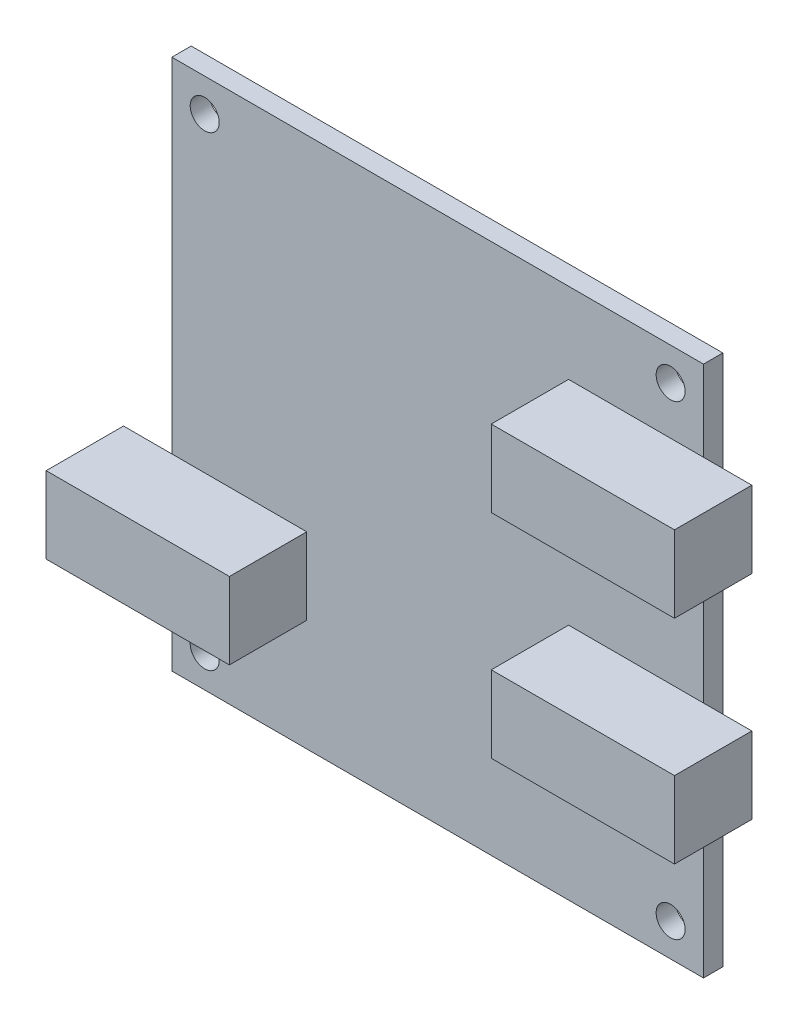
ISO-10303-21;
HEADER;
FILE_DESCRIPTION(('STEP AP214'),'2;1');
FILE_NAME('part.step','',(''),(''),'','','');
FILE_SCHEMA(('AUTOMOTIVE_DESIGN { 1 0 10303 214 1 1 1 1 }'));
ENDSEC;
DATA;
#1=APPLICATION_CONTEXT('core data for automotive mechanical design processes');
#2=APPLICATION_PROTOCOL_DEFINITION('international standard','automotive_design',2000,#1);
#3=PRODUCT_CONTEXT('',#1,'mechanical');
#4=PRODUCT('Part','Part','',(#3));
#5=PRODUCT_RELATED_PRODUCT_CATEGORY('part','',(#4));
#6=PRODUCT_DEFINITION_FORMATION('','',#4);
#7=PRODUCT_DEFINITION_CONTEXT('part definition',#1,'design');
#8=PRODUCT_DEFINITION('design','',#6,#7);
#9=PRODUCT_DEFINITION_SHAPE('','',#8);
#10=(LENGTH_UNIT() NAMED_UNIT(*) SI_UNIT(.MILLI.,.METRE.));
#11=(NAMED_UNIT(*) PLANE_ANGLE_UNIT() SI_UNIT($,.RADIAN.));
#12=(NAMED_UNIT(*) SI_UNIT($,.STERADIAN.) SOLID_ANGLE_UNIT());
#13=UNCERTAINTY_MEASURE_WITH_UNIT(LENGTH_MEASURE(1.E-05),#10,'distance_accuracy_value','');
#14=(GEOMETRIC_REPRESENTATION_CONTEXT(3) GLOBAL_UNCERTAINTY_ASSIGNED_CONTEXT((#13)) GLOBAL_UNIT_ASSIGNED_CONTEXT((#10,
#11,#12)) REPRESENTATION_CONTEXT('',''));
#15=CARTESIAN_POINT('',(0.,0.,0.));
#16=DIRECTION('',(0.,0.,1.));
#17=DIRECTION('',(1.,0.,0.));
#18=AXIS2_PLACEMENT_3D('',#15,#16,#17);
#19=CARTESIAN_POINT('',(13.5436408472055,-2.86503978913871,10.));
#20=DIRECTION('',(1.,0.,0.));
#21=DIRECTION('',(0.,1.,0.));
#22=AXIS2_PLACEMENT_3D('',#19,#20,#21);
#23=PLANE('',#22);
#24=DIRECTION('',(0.,-1.,0.));
#25=VECTOR('',#24,1.);
#26=CARTESIAN_POINT('',(13.5436408472055,-2.86503978913871,2.));
#27=LINE('',#26,#25);
#28=CARTESIAN_POINT('',(13.5436408472055,-2.86503978913871,2.));
#29=VERTEX_POINT('',#28);
#30=CARTESIAN_POINT('',(13.5436408472055,-10.7929581097691,2.));
#31=VERTEX_POINT('',#30);
#32=EDGE_CURVE('E12',#29,#31,#27,.T.);
#33=ORIENTED_EDGE('',*,*,#32,.T.);
#34=DIRECTION('',(0.,0.,-1.));
#35=VECTOR('',#34,1.);
#36=CARTESIAN_POINT('',(13.5436408472055,-10.7929581097691,10.));
#37=LINE('',#36,#35);
#38=CARTESIAN_POINT('',(13.5436408472055,-10.7929581097691,10.));
#39=VERTEX_POINT('',#38);
#40=EDGE_CURVE('E121',#39,#31,#37,.T.);
#41=ORIENTED_EDGE('',*,*,#40,.F.);
#42=DIRECTION('',(0.,-1.,0.));
#43=VECTOR('',#42,1.);
#44=CARTESIAN_POINT('',(13.5436408472055,-2.86503978913871,10.));
#45=LINE('',#44,#43);
#46=CARTESIAN_POINT('',(13.5436408472055,-2.86503978913871,10.));
#47=VERTEX_POINT('',#46);
#48=EDGE_CURVE('E54',#47,#39,#45,.T.);
#49=ORIENTED_EDGE('',*,*,#48,.F.);
#50=DIRECTION('',(0.,0.,-1.));
#51=VECTOR('',#50,1.);
#52=CARTESIAN_POINT('',(13.5436408472055,-2.86503978913871,10.));
#53=LINE('',#52,#51);
#54=EDGE_CURVE('E109',#47,#29,#53,.T.);
#55=ORIENTED_EDGE('',*,*,#54,.T.);
#56=EDGE_LOOP('',(#33,#41,#49,#55));
#57=FACE_BOUND('',#56,.T.);
#58=ADVANCED_FACE('F50',(#57),#23,.F.);
#59=CARTESIAN_POINT('',(13.5436408472055,-10.7929581097691,10.));
#60=DIRECTION('',(0.,1.,0.));
#61=DIRECTION('',(-1.,0.,0.));
#62=AXIS2_PLACEMENT_3D('',#59,#60,#61);
#63=PLANE('',#62);
#64=DIRECTION('',(1.,0.,0.));
#65=VECTOR('',#64,1.);
#66=CARTESIAN_POINT('',(13.5436408472055,-10.7929581097691,2.));
#67=LINE('',#66,#65);
#68=CARTESIAN_POINT('',(32.5,-10.7929581097691,2.));
#69=VERTEX_POINT('',#68);
#70=EDGE_CURVE('E60',#31,#69,#67,.T.);
#71=ORIENTED_EDGE('',*,*,#70,.T.);
#72=DIRECTION('',(0.,0.,-1.));
#73=VECTOR('',#72,1.);
#74=CARTESIAN_POINT('',(32.5,-10.7929581097691,10.));
#75=LINE('',#74,#73);
#76=CARTESIAN_POINT('',(32.5,-10.7929581097691,10.));
#77=VERTEX_POINT('',#76);
#78=EDGE_CURVE('E105',#77,#69,#75,.T.);
#79=ORIENTED_EDGE('',*,*,#78,.F.);
#80=DIRECTION('',(1.,0.,0.));
#81=VECTOR('',#80,1.);
#82=CARTESIAN_POINT('',(13.5436408472055,-10.7929581097691,10.));
#83=LINE('',#82,#81);
#84=EDGE_CURVE('E84',#39,#77,#83,.T.);
#85=ORIENTED_EDGE('',*,*,#84,.F.);
#86=ORIENTED_EDGE('',*,*,#40,.T.);
#87=EDGE_LOOP('',(#71,#79,#85,#86));
#88=FACE_BOUND('',#87,.T.);
#89=ADVANCED_FACE('F124',(#88),#63,.F.);
#90=CARTESIAN_POINT('',(32.5,-2.86503978913871,10.));
#91=DIRECTION('',(-1.,0.,0.));
#92=DIRECTION('',(0.,0.,1.));
#93=AXIS2_PLACEMENT_3D('',#90,#91,#92);
#94=PLANE('',#93);
#95=DIRECTION('',(0.,1.,0.));
#96=VECTOR('',#95,1.);
#97=CARTESIAN_POINT('',(32.5,-2.86503978913871,2.));
#98=LINE('',#97,#96);
#99=CARTESIAN_POINT('',(32.5,-2.86503978913871,2.));
#100=VERTEX_POINT('',#99);
#101=EDGE_CURVE('E100',#69,#100,#98,.T.);
#102=ORIENTED_EDGE('',*,*,#101,.T.);
#103=DIRECTION('',(0.,0.,-1.));
#104=VECTOR('',#103,1.);
#105=CARTESIAN_POINT('',(32.5,-2.86503978913871,10.));
#106=LINE('',#105,#104);
#107=CARTESIAN_POINT('',(32.5,-2.86503978913871,10.));
#108=VERTEX_POINT('',#107);
#109=EDGE_CURVE('E103',#108,#100,#106,.T.);
#110=ORIENTED_EDGE('',*,*,#109,.F.);
#111=DIRECTION('',(0.,1.,0.));
#112=VECTOR('',#111,1.);
#113=CARTESIAN_POINT('',(32.5,-2.86503978913871,10.));
#114=LINE('',#113,#112);
#115=EDGE_CURVE('E117',#77,#108,#114,.T.);
#116=ORIENTED_EDGE('',*,*,#115,.F.);
#117=ORIENTED_EDGE('',*,*,#78,.T.);
#118=EDGE_LOOP('',(#102,#110,#116,#117));
#119=FACE_BOUND('',#118,.T.);
#120=ADVANCED_FACE('F101',(#119),#94,.F.);
#121=CARTESIAN_POINT('',(13.5436408472055,-2.86503978913871,10.));
#122=DIRECTION('',(0.,-1.,0.));
#123=DIRECTION('',(0.,0.,-1.));
#124=AXIS2_PLACEMENT_3D('',#121,#122,#123);
#125=PLANE('',#124);
#126=DIRECTION('',(-1.,0.,0.));
#127=VECTOR('',#126,1.);
#128=CARTESIAN_POINT('',(13.5436408472055,-2.86503978913871,2.));
#129=LINE('',#128,#127);
#130=EDGE_CURVE('E94',#100,#29,#129,.T.);
#131=ORIENTED_EDGE('',*,*,#130,.T.);
#132=ORIENTED_EDGE('',*,*,#54,.F.);
#133=DIRECTION('',(-1.,0.,0.));
#134=VECTOR('',#133,1.);
#135=CARTESIAN_POINT('',(13.5436408472055,-2.86503978913871,10.));
#136=LINE('',#135,#134);
#137=EDGE_CURVE('E108',#108,#47,#136,.T.);
#138=ORIENTED_EDGE('',*,*,#137,.F.);
#139=ORIENTED_EDGE('',*,*,#109,.T.);
#140=EDGE_LOOP('',(#131,#132,#138,#139));
#141=FACE_BOUND('',#140,.T.);
#142=ADVANCED_FACE('F107',(#141),#125,.F.);
#143=CARTESIAN_POINT('',(0.,0.,10.));
#144=DIRECTION('',(0.,0.,1.));
#145=DIRECTION('',(1.,0.,0.));
#146=AXIS2_PLACEMENT_3D('',#143,#144,#145);
#147=PLANE('',#146);
#148=ORIENTED_EDGE('',*,*,#48,.T.);
#149=ORIENTED_EDGE('',*,*,#84,.T.);
#150=ORIENTED_EDGE('',*,*,#115,.T.);
#151=ORIENTED_EDGE('',*,*,#137,.T.);
#152=EDGE_LOOP('',(#148,#149,#150,#151));
#153=FACE_BOUND('',#152,.T.);
#154=ADVANCED_FACE('F52',(#153),#147,.T.);
#155=CARTESIAN_POINT('',(0.,0.,2.));
#156=DIRECTION('',(0.,0.,1.));
#157=DIRECTION('',(1.,0.,0.));
#158=AXIS2_PLACEMENT_3D('',#155,#156,#157);
#159=PLANE('',#158);
#160=ORIENTED_EDGE('',*,*,#32,.F.);
#161=ORIENTED_EDGE('',*,*,#130,.F.);
#162=ORIENTED_EDGE('',*,*,#101,.F.);
#163=ORIENTED_EDGE('',*,*,#70,.F.);
#164=EDGE_LOOP('',(#160,#161,#162,#163));
#165=FACE_BOUND('',#164,.T.);
#166=ADVANCED_FACE('F111',(#165),#159,.F.);
#167=CLOSED_SHELL('',(#58,#89,#120,#142,#154,#166));
#168=MANIFOLD_SOLID_BREP('B2',#167);
#169=CARTESIAN_POINT('',(13.5436408472055,19.1525947547903,10.));
#170=DIRECTION('',(1.,0.,0.));
#171=DIRECTION('',(0.,1.,0.));
#172=AXIS2_PLACEMENT_3D('',#169,#170,#171);
#173=PLANE('',#172);
#174=DIRECTION('',(0.,-1.,0.));
#175=VECTOR('',#174,1.);
#176=CARTESIAN_POINT('',(13.5436408472055,19.1525947547903,2.));
#177=LINE('',#176,#175);
#178=CARTESIAN_POINT('',(13.5436408472055,19.1525947547903,2.));
#179=VERTEX_POINT('',#178);
#180=CARTESIAN_POINT('',(13.5436408472055,11.2246764341599,2.));
#181=VERTEX_POINT('',#180);
#182=EDGE_CURVE('E48',#179,#181,#177,.T.);
#183=ORIENTED_EDGE('',*,*,#182,.T.);
#184=DIRECTION('',(0.,0.,-1.));
#185=VECTOR('',#184,1.);
#186=CARTESIAN_POINT('',(13.5436408472055,11.2246764341599,10.));
#187=LINE('',#186,#185);
#188=CARTESIAN_POINT('',(13.5436408472055,11.2246764341599,10.));
#189=VERTEX_POINT('',#188);
#190=EDGE_CURVE('E255',#189,#181,#187,.T.);
#191=ORIENTED_EDGE('',*,*,#190,.F.);
#192=DIRECTION('',(0.,-1.,0.));
#193=VECTOR('',#192,1.);
#194=CARTESIAN_POINT('',(13.5436408472055,19.1525947547903,10.));
#195=LINE('',#194,#193);
#196=CARTESIAN_POINT('',(13.5436408472055,19.1525947547903,10.));
#197=VERTEX_POINT('',#196);
#198=EDGE_CURVE('E188',#197,#189,#195,.T.);
#199=ORIENTED_EDGE('',*,*,#198,.F.);
#200=DIRECTION('',(0.,0.,-1.));
#201=VECTOR('',#200,1.);
#202=CARTESIAN_POINT('',(13.5436408472055,19.1525947547903,10.));
#203=LINE('',#202,#201);
#204=EDGE_CURVE('E243',#197,#179,#203,.T.);
#205=ORIENTED_EDGE('',*,*,#204,.T.);
#206=EDGE_LOOP('',(#183,#191,#199,#205));
#207=FACE_BOUND('',#206,.T.);
#208=ADVANCED_FACE('F184',(#207),#173,.F.);
#209=CARTESIAN_POINT('',(13.5436408472055,11.2246764341599,10.));
#210=DIRECTION('',(0.,1.,0.));
#211=DIRECTION('',(-1.,0.,0.));
#212=AXIS2_PLACEMENT_3D('',#209,#210,#211);
#213=PLANE('',#212);
#214=DIRECTION('',(1.,0.,0.));
#215=VECTOR('',#214,1.);
#216=CARTESIAN_POINT('',(13.5436408472055,11.2246764341599,2.));
#217=LINE('',#216,#215);
#218=CARTESIAN_POINT('',(32.5,11.2246764341599,2.));
#219=VERTEX_POINT('',#218);
#220=EDGE_CURVE('E194',#181,#219,#217,.T.);
#221=ORIENTED_EDGE('',*,*,#220,.T.);
#222=DIRECTION('',(0.,0.,-1.));
#223=VECTOR('',#222,1.);
#224=CARTESIAN_POINT('',(32.5,11.2246764341599,10.));
#225=LINE('',#224,#223);
#226=CARTESIAN_POINT('',(32.5,11.2246764341599,10.));
#227=VERTEX_POINT('',#226);
#228=EDGE_CURVE('E239',#227,#219,#225,.T.);
#229=ORIENTED_EDGE('',*,*,#228,.F.);
#230=DIRECTION('',(1.,0.,0.));
#231=VECTOR('',#230,1.);
#232=CARTESIAN_POINT('',(13.5436408472055,11.2246764341599,10.));
#233=LINE('',#232,#231);
#234=EDGE_CURVE('E218',#189,#227,#233,.T.);
#235=ORIENTED_EDGE('',*,*,#234,.F.);
#236=ORIENTED_EDGE('',*,*,#190,.T.);
#237=EDGE_LOOP('',(#221,#229,#235,#236));
#238=FACE_BOUND('',#237,.T.);
#239=ADVANCED_FACE('F258',(#238),#213,.F.);
#240=CARTESIAN_POINT('',(32.5,19.1525947547903,10.));
#241=DIRECTION('',(-1.,0.,0.));
#242=DIRECTION('',(0.,-1.,0.));
#243=AXIS2_PLACEMENT_3D('',#240,#241,#242);
#244=PLANE('',#243);
#245=DIRECTION('',(0.,1.,0.));
#246=VECTOR('',#245,1.);
#247=CARTESIAN_POINT('',(32.5,19.1525947547903,2.));
#248=LINE('',#247,#246);
#249=CARTESIAN_POINT('',(32.5,19.1525947547903,2.));
#250=VERTEX_POINT('',#249);
#251=EDGE_CURVE('E234',#219,#250,#248,.T.);
#252=ORIENTED_EDGE('',*,*,#251,.T.);
#253=DIRECTION('',(0.,0.,-1.));
#254=VECTOR('',#253,1.);
#255=CARTESIAN_POINT('',(32.5,19.1525947547903,10.));
#256=LINE('',#255,#254);
#257=CARTESIAN_POINT('',(32.5,19.1525947547903,10.));
#258=VERTEX_POINT('',#257);
#259=EDGE_CURVE('E237',#258,#250,#256,.T.);
#260=ORIENTED_EDGE('',*,*,#259,.F.);
#261=DIRECTION('',(0.,1.,0.));
#262=VECTOR('',#261,1.);
#263=CARTESIAN_POINT('',(32.5,19.1525947547903,10.));
#264=LINE('',#263,#262);
#265=EDGE_CURVE('E251',#227,#258,#264,.T.);
#266=ORIENTED_EDGE('',*,*,#265,.F.);
#267=ORIENTED_EDGE('',*,*,#228,.T.);
#268=EDGE_LOOP('',(#252,#260,#266,#267));
#269=FACE_BOUND('',#268,.T.);
#270=ADVANCED_FACE('F235',(#269),#244,.F.);
#271=CARTESIAN_POINT('',(13.5436408472055,19.1525947547903,10.));
#272=DIRECTION('',(0.,-1.,0.));
#273=DIRECTION('',(1.,0.,0.));
#274=AXIS2_PLACEMENT_3D('',#271,#272,#273);
#275=PLANE('',#274);
#276=DIRECTION('',(-1.,0.,0.));
#277=VECTOR('',#276,1.);
#278=CARTESIAN_POINT('',(13.5436408472055,19.1525947547903,2.));
#279=LINE('',#278,#277);
#280=EDGE_CURVE('E228',#250,#179,#279,.T.);
#281=ORIENTED_EDGE('',*,*,#280,.T.);
#282=ORIENTED_EDGE('',*,*,#204,.F.);
#283=DIRECTION('',(-1.,0.,0.));
#284=VECTOR('',#283,1.);
#285=CARTESIAN_POINT('',(13.5436408472055,19.1525947547903,10.));
#286=LINE('',#285,#284);
#287=EDGE_CURVE('E242',#258,#197,#286,.T.);
#288=ORIENTED_EDGE('',*,*,#287,.F.);
#289=ORIENTED_EDGE('',*,*,#259,.T.);
#290=EDGE_LOOP('',(#281,#282,#288,#289));
#291=FACE_BOUND('',#290,.T.);
#292=ADVANCED_FACE('F241',(#291),#275,.F.);
#293=CARTESIAN_POINT('',(0.,0.,10.));
#294=DIRECTION('',(0.,0.,1.));
#295=DIRECTION('',(1.,0.,0.));
#296=AXIS2_PLACEMENT_3D('',#293,#294,#295);
#297=PLANE('',#296);
#298=ORIENTED_EDGE('',*,*,#198,.T.);
#299=ORIENTED_EDGE('',*,*,#234,.T.);
#300=ORIENTED_EDGE('',*,*,#265,.T.);
#301=ORIENTED_EDGE('',*,*,#287,.T.);
#302=EDGE_LOOP('',(#298,#299,#300,#301));
#303=FACE_BOUND('',#302,.T.);
#304=ADVANCED_FACE('F186',(#303),#297,.T.);
#305=CARTESIAN_POINT('',(0.,0.,2.));
#306=DIRECTION('',(0.,0.,1.));
#307=DIRECTION('',(1.,0.,0.));
#308=AXIS2_PLACEMENT_3D('',#305,#306,#307);
#309=PLANE('',#308);
#310=ORIENTED_EDGE('',*,*,#182,.F.);
#311=ORIENTED_EDGE('',*,*,#280,.F.);
#312=ORIENTED_EDGE('',*,*,#251,.F.);
#313=ORIENTED_EDGE('',*,*,#220,.F.);
#314=EDGE_LOOP('',(#310,#311,#312,#313));
#315=FACE_BOUND('',#314,.T.);
#316=ADVANCED_FACE('F245',(#315),#309,.F.);
#317=CLOSED_SHELL('',(#208,#239,#270,#292,#304,#316));
#318=MANIFOLD_SOLID_BREP('B6',#317);
#319=CARTESIAN_POINT('',(-32.5,-8.0456596818279,10.));
#320=DIRECTION('',(1.,0.,0.));
#321=DIRECTION('',(0.,0.,-1.));
#322=AXIS2_PLACEMENT_3D('',#319,#320,#321);
#323=PLANE('',#322);
#324=DIRECTION('',(0.,-1.,0.));
#325=VECTOR('',#324,1.);
#326=CARTESIAN_POINT('',(-32.5,-8.0456596818279,2.));
#327=LINE('',#326,#325);
#328=CARTESIAN_POINT('',(-32.5,-8.0456596818279,2.));
#329=VERTEX_POINT('',#328);
#330=CARTESIAN_POINT('',(-32.5,-15.9735780024583,2.));
#331=VERTEX_POINT('',#330);
#332=EDGE_CURVE('E380',#329,#331,#327,.T.);
#333=ORIENTED_EDGE('',*,*,#332,.T.);
#334=DIRECTION('',(0.,0.,-1.));
#335=VECTOR('',#334,1.);
#336=CARTESIAN_POINT('',(-32.5,-15.9735780024583,10.));
#337=LINE('',#336,#335);
#338=CARTESIAN_POINT('',(-32.5,-15.9735780024583,10.));
#339=VERTEX_POINT('',#338);
#340=EDGE_CURVE('E182',#339,#331,#337,.T.);
#341=ORIENTED_EDGE('',*,*,#340,.F.);
#342=DIRECTION('',(0.,-1.,0.));
#343=VECTOR('',#342,1.);
#344=CARTESIAN_POINT('',(-32.5,-8.0456596818279,10.));
#345=LINE('',#344,#343);
#346=CARTESIAN_POINT('',(-32.5,-8.0456596818279,10.));
#347=VERTEX_POINT('',#346);
#348=EDGE_CURVE('E368',#347,#339,#345,.T.);
#349=ORIENTED_EDGE('',*,*,#348,.F.);
#350=DIRECTION('',(0.,0.,-1.));
#351=VECTOR('',#350,1.);
#352=CARTESIAN_POINT('',(-32.5,-8.0456596818279,10.));
#353=LINE('',#352,#351);
#354=EDGE_CURVE('E376',#347,#329,#353,.T.);
#355=ORIENTED_EDGE('',*,*,#354,.T.);
#356=EDGE_LOOP('',(#333,#341,#349,#355));
#357=FACE_BOUND('',#356,.T.);
#358=ADVANCED_FACE('F317',(#357),#323,.F.);
#359=CARTESIAN_POINT('',(-32.5,-15.9735780024583,10.));
#360=DIRECTION('',(0.,1.,0.));
#361=DIRECTION('',(0.,0.,1.));
#362=AXIS2_PLACEMENT_3D('',#359,#360,#361);
#363=PLANE('',#362);
#364=DIRECTION('',(1.,0.,0.));
#365=VECTOR('',#364,1.);
#366=CARTESIAN_POINT('',(-32.5,-15.9735780024583,2.));
#367=LINE('',#366,#365);
#368=CARTESIAN_POINT('',(-13.5436408472055,-15.9735780024583,2.));
#369=VERTEX_POINT('',#368);
#370=EDGE_CURVE('E372',#331,#369,#367,.T.);
#371=ORIENTED_EDGE('',*,*,#370,.T.);
#372=DIRECTION('',(0.,0.,-1.));
#373=VECTOR('',#372,1.);
#374=CARTESIAN_POINT('',(-13.5436408472055,-15.9735780024583,10.));
#375=LINE('',#374,#373);
#376=CARTESIAN_POINT('',(-13.5436408472055,-15.9735780024583,10.));
#377=VERTEX_POINT('',#376);
#378=EDGE_CURVE('E325',#377,#369,#375,.T.);
#379=ORIENTED_EDGE('',*,*,#378,.F.);
#380=DIRECTION('',(1.,0.,0.));
#381=VECTOR('',#380,1.);
#382=CARTESIAN_POINT('',(-32.5,-15.9735780024583,10.));
#383=LINE('',#382,#381);
#384=EDGE_CURVE('E363',#339,#377,#383,.T.);
#385=ORIENTED_EDGE('',*,*,#384,.F.);
#386=ORIENTED_EDGE('',*,*,#340,.T.);
#387=EDGE_LOOP('',(#371,#379,#385,#386));
#388=FACE_BOUND('',#387,.T.);
#389=ADVANCED_FACE('F371',(#388),#363,.F.);
#390=CARTESIAN_POINT('',(-13.5436408472055,-8.0456596818279,10.));
#391=DIRECTION('',(-1.,0.,0.));
#392=DIRECTION('',(0.,0.,1.));
#393=AXIS2_PLACEMENT_3D('',#390,#391,#392);
#394=PLANE('',#393);
#395=DIRECTION('',(0.,1.,0.));
#396=VECTOR('',#395,1.);
#397=CARTESIAN_POINT('',(-13.5436408472055,-8.0456596818279,2.));
#398=LINE('',#397,#396);
#399=CARTESIAN_POINT('',(-13.5436408472055,-8.0456596818279,2.));
#400=VERTEX_POINT('',#399);
#401=EDGE_CURVE('E350',#369,#400,#398,.T.);
#402=ORIENTED_EDGE('',*,*,#401,.T.);
#403=DIRECTION('',(0.,0.,-1.));
#404=VECTOR('',#403,1.);
#405=CARTESIAN_POINT('',(-13.5436408472055,-8.0456596818279,10.));
#406=LINE('',#405,#404);
#407=CARTESIAN_POINT('',(-13.5436408472055,-8.0456596818279,10.));
#408=VERTEX_POINT('',#407);
#409=EDGE_CURVE('E373',#408,#400,#406,.T.);
#410=ORIENTED_EDGE('',*,*,#409,.F.);
#411=DIRECTION('',(0.,1.,0.));
#412=VECTOR('',#411,1.);
#413=CARTESIAN_POINT('',(-13.5436408472055,-8.0456596818279,10.));
#414=LINE('',#413,#412);
#415=EDGE_CURVE('E366',#377,#408,#414,.T.);
#416=ORIENTED_EDGE('',*,*,#415,.F.);
#417=ORIENTED_EDGE('',*,*,#378,.T.);
#418=EDGE_LOOP('',(#402,#410,#416,#417));
#419=FACE_BOUND('',#418,.T.);
#420=ADVANCED_FACE('F374',(#419),#394,.F.);
#421=CARTESIAN_POINT('',(-32.5,-8.0456596818279,10.));
#422=DIRECTION('',(0.,-1.,0.));
#423=DIRECTION('',(0.,0.,-1.));
#424=AXIS2_PLACEMENT_3D('',#421,#422,#423);
#425=PLANE('',#424);
#426=DIRECTION('',(-1.,0.,0.));
#427=VECTOR('',#426,1.);
#428=CARTESIAN_POINT('',(-32.5,-8.0456596818279,2.));
#429=LINE('',#428,#427);
#430=EDGE_CURVE('E356',#400,#329,#429,.T.);
#431=ORIENTED_EDGE('',*,*,#430,.T.);
#432=ORIENTED_EDGE('',*,*,#354,.F.);
#433=DIRECTION('',(-1.,0.,0.));
#434=VECTOR('',#433,1.);
#435=CARTESIAN_POINT('',(-32.5,-8.0456596818279,10.));
#436=LINE('',#435,#434);
#437=EDGE_CURVE('E333',#408,#347,#436,.T.);
#438=ORIENTED_EDGE('',*,*,#437,.F.);
#439=ORIENTED_EDGE('',*,*,#409,.T.);
#440=EDGE_LOOP('',(#431,#432,#438,#439));
#441=FACE_BOUND('',#440,.T.);
#442=ADVANCED_FACE('F387',(#441),#425,.F.);
#443=CARTESIAN_POINT('',(0.,0.,10.));
#444=DIRECTION('',(0.,0.,1.));
#445=DIRECTION('',(1.,0.,0.));
#446=AXIS2_PLACEMENT_3D('',#443,#444,#445);
#447=PLANE('',#446);
#448=ORIENTED_EDGE('',*,*,#348,.T.);
#449=ORIENTED_EDGE('',*,*,#384,.T.);
#450=ORIENTED_EDGE('',*,*,#415,.T.);
#451=ORIENTED_EDGE('',*,*,#437,.T.);
#452=EDGE_LOOP('',(#448,#449,#450,#451));
#453=FACE_BOUND('',#452,.T.);
#454=ADVANCED_FACE('F364',(#453),#447,.T.);
#455=CARTESIAN_POINT('',(0.,0.,2.));
#456=DIRECTION('',(0.,0.,1.));
#457=DIRECTION('',(1.,0.,0.));
#458=AXIS2_PLACEMENT_3D('',#455,#456,#457);
#459=PLANE('',#458);
#460=ORIENTED_EDGE('',*,*,#332,.F.);
#461=ORIENTED_EDGE('',*,*,#430,.F.);
#462=ORIENTED_EDGE('',*,*,#401,.F.);
#463=ORIENTED_EDGE('',*,*,#370,.F.);
#464=EDGE_LOOP('',(#460,#461,#462,#463));
#465=FACE_BOUND('',#464,.T.);
#466=ADVANCED_FACE('F390',(#465),#459,.F.);
#467=CLOSED_SHELL('',(#358,#389,#420,#442,#454,#466));
#468=MANIFOLD_SOLID_BREP('B42',#467);
#469=CARTESIAN_POINT('',(27.5,27.5,2.));
#470=DIRECTION('',(0.,-1.,0.));
#471=DIRECTION('',(0.,0.,-1.));
#472=AXIS2_PLACEMENT_3D('',#469,#470,#471);
#473=PLANE('',#472);
#474=DIRECTION('',(-1.,0.,0.));
#475=VECTOR('',#474,1.);
#476=CARTESIAN_POINT('',(27.5,27.5,0.));
#477=LINE('',#476,#475);
#478=CARTESIAN_POINT('',(27.5,27.5,0.));
#479=VERTEX_POINT('',#478);
#480=CARTESIAN_POINT('',(-27.5,27.5,0.));
#481=VERTEX_POINT('',#480);
#482=EDGE_CURVE('E504',#479,#481,#477,.T.);
#483=ORIENTED_EDGE('',*,*,#482,.T.);
#484=DIRECTION('',(0.,0.,-1.));
#485=VECTOR('',#484,1.);
#486=CARTESIAN_POINT('',(-27.5,27.5,2.));
#487=LINE('',#486,#485);
#488=CARTESIAN_POINT('',(-27.5,27.5,2.));
#489=VERTEX_POINT('',#488);
#490=EDGE_CURVE('E315',#489,#481,#487,.T.);
#491=ORIENTED_EDGE('',*,*,#490,.F.);
#492=DIRECTION('',(-1.,0.,0.));
#493=VECTOR('',#492,1.);
#494=CARTESIAN_POINT('',(27.5,27.5,2.));
#495=LINE('',#494,#493);
#496=CARTESIAN_POINT('',(27.5,27.5,2.));
#497=VERTEX_POINT('',#496);
#498=EDGE_CURVE('E492',#497,#489,#495,.T.);
#499=ORIENTED_EDGE('',*,*,#498,.F.);
#500=DIRECTION('',(0.,0.,-1.));
#501=VECTOR('',#500,1.);
#502=CARTESIAN_POINT('',(27.5,27.5,2.));
#503=LINE('',#502,#501);
#504=EDGE_CURVE('E500',#497,#479,#503,.T.);
#505=ORIENTED_EDGE('',*,*,#504,.T.);
#506=EDGE_LOOP('',(#483,#491,#499,#505));
#507=FACE_BOUND('',#506,.T.);
#508=ADVANCED_FACE('F441',(#507),#473,.F.);
#509=CARTESIAN_POINT('',(-27.5,-27.5,2.));
#510=DIRECTION('',(1.,0.,0.));
#511=DIRECTION('',(0.,0.,-1.));
#512=AXIS2_PLACEMENT_3D('',#509,#510,#511);
#513=PLANE('',#512);
#514=DIRECTION('',(0.,-1.,0.));
#515=VECTOR('',#514,1.);
#516=CARTESIAN_POINT('',(-27.5,-27.5,0.));
#517=LINE('',#516,#515);
#518=CARTESIAN_POINT('',(-27.5,-27.5,0.));
#519=VERTEX_POINT('',#518);
#520=EDGE_CURVE('E496',#481,#519,#517,.T.);
#521=ORIENTED_EDGE('',*,*,#520,.T.);
#522=DIRECTION('',(0.,0.,-1.));
#523=VECTOR('',#522,1.);
#524=CARTESIAN_POINT('',(-27.5,-27.5,2.));
#525=LINE('',#524,#523);
#526=CARTESIAN_POINT('',(-27.5,-27.5,2.));
#527=VERTEX_POINT('',#526);
#528=EDGE_CURVE('E449',#527,#519,#525,.T.);
#529=ORIENTED_EDGE('',*,*,#528,.F.);
#530=DIRECTION('',(0.,-1.,0.));
#531=VECTOR('',#530,1.);
#532=CARTESIAN_POINT('',(-27.5,-27.5,2.));
#533=LINE('',#532,#531);
#534=EDGE_CURVE('E487',#489,#527,#533,.T.);
#535=ORIENTED_EDGE('',*,*,#534,.F.);
#536=ORIENTED_EDGE('',*,*,#490,.T.);
#537=EDGE_LOOP('',(#521,#529,#535,#536));
#538=FACE_BOUND('',#537,.T.);
#539=ADVANCED_FACE('F495',(#538),#513,.F.);
#540=CARTESIAN_POINT('',(27.5,-27.5,2.));
#541=DIRECTION('',(0.,1.,0.));
#542=DIRECTION('',(0.,0.,1.));
#543=AXIS2_PLACEMENT_3D('',#540,#541,#542);
#544=PLANE('',#543);
#545=DIRECTION('',(1.,0.,0.));
#546=VECTOR('',#545,1.);
#547=CARTESIAN_POINT('',(27.5,-27.5,0.));
#548=LINE('',#547,#546);
#549=CARTESIAN_POINT('',(27.5,-27.5,0.));
#550=VERTEX_POINT('',#549);
#551=EDGE_CURVE('E474',#519,#550,#548,.T.);
#552=ORIENTED_EDGE('',*,*,#551,.T.);
#553=DIRECTION('',(0.,0.,-1.));
#554=VECTOR('',#553,1.);
#555=CARTESIAN_POINT('',(27.5,-27.5,2.));
#556=LINE('',#555,#554);
#557=CARTESIAN_POINT('',(27.5,-27.5,2.));
#558=VERTEX_POINT('',#557);
#559=EDGE_CURVE('E497',#558,#550,#556,.T.);
#560=ORIENTED_EDGE('',*,*,#559,.F.);
#561=DIRECTION('',(1.,0.,0.));
#562=VECTOR('',#561,1.);
#563=CARTESIAN_POINT('',(27.5,-27.5,2.));
#564=LINE('',#563,#562);
#565=EDGE_CURVE('E490',#527,#558,#564,.T.);
#566=ORIENTED_EDGE('',*,*,#565,.F.);
#567=ORIENTED_EDGE('',*,*,#528,.T.);
#568=EDGE_LOOP('',(#552,#560,#566,#567));
#569=FACE_BOUND('',#568,.T.);
#570=ADVANCED_FACE('F498',(#569),#544,.F.);
#571=CARTESIAN_POINT('',(27.5,-27.5,2.));
#572=DIRECTION('',(-1.,0.,0.));
#573=DIRECTION('',(0.,0.,1.));
#574=AXIS2_PLACEMENT_3D('',#571,#572,#573);
#575=PLANE('',#574);
#576=DIRECTION('',(0.,1.,0.));
#577=VECTOR('',#576,1.);
#578=CARTESIAN_POINT('',(27.5,-27.5,0.));
#579=LINE('',#578,#577);
#580=EDGE_CURVE('E480',#550,#479,#579,.T.);
#581=ORIENTED_EDGE('',*,*,#580,.T.);
#582=ORIENTED_EDGE('',*,*,#504,.F.);
#583=DIRECTION('',(0.,1.,0.));
#584=VECTOR('',#583,1.);
#585=CARTESIAN_POINT('',(27.5,-27.5,2.));
#586=LINE('',#585,#584);
#587=EDGE_CURVE('E457',#558,#497,#586,.T.);
#588=ORIENTED_EDGE('',*,*,#587,.F.);
#589=ORIENTED_EDGE('',*,*,#559,.T.);
#590=EDGE_LOOP('',(#581,#582,#588,#589));
#591=FACE_BOUND('',#590,.T.);
#592=ADVANCED_FACE('F512',(#591),#575,.F.);
#593=CARTESIAN_POINT('',(0.,0.,2.));
#594=DIRECTION('',(0.,0.,-1.));
#595=DIRECTION('',(-1.,0.,0.));
#596=AXIS2_PLACEMENT_3D('',#593,#594,#595);
#597=PLANE('',#596);
#598=CARTESIAN_POINT('',(-24.1,24.1,2.));
#599=DIRECTION('',(0.,0.,1.));
#600=DIRECTION('',(1.,0.,0.));
#601=AXIS2_PLACEMENT_3D('',#598,#599,#600);
#602=CIRCLE('',#601,1.5);
#603=CARTESIAN_POINT('',(-22.6,24.1,2.));
#604=VERTEX_POINT('',#603);
#605=EDGE_CURVE('E527',#604,#604,#602,.T.);
#606=ORIENTED_EDGE('',*,*,#605,.F.);
#607=EDGE_LOOP('',(#606));
#608=FACE_BOUND('',#607,.T.);
#609=CARTESIAN_POINT('',(-24.1,-24.1,2.));
#610=DIRECTION('',(0.,0.,1.));
#611=DIRECTION('',(1.,0.,0.));
#612=AXIS2_PLACEMENT_3D('',#609,#610,#611);
#613=CIRCLE('',#612,1.5);
#614=CARTESIAN_POINT('',(-22.6,-24.1,2.));
#615=VERTEX_POINT('',#614);
#616=EDGE_CURVE('E533',#615,#615,#613,.T.);
#617=ORIENTED_EDGE('',*,*,#616,.F.);
#618=EDGE_LOOP('',(#617));
#619=FACE_BOUND('',#618,.T.);
#620=CARTESIAN_POINT('',(24.1,-24.1,2.));
#621=DIRECTION('',(0.,0.,1.));
#622=DIRECTION('',(1.,0.,0.));
#623=AXIS2_PLACEMENT_3D('',#620,#621,#622);
#624=CIRCLE('',#623,1.5);
#625=CARTESIAN_POINT('',(25.6,-24.1,2.));
#626=VERTEX_POINT('',#625);
#627=EDGE_CURVE('E521',#626,#626,#624,.T.);
#628=ORIENTED_EDGE('',*,*,#627,.F.);
#629=EDGE_LOOP('',(#628));
#630=FACE_BOUND('',#629,.T.);
#631=CARTESIAN_POINT('',(24.1,24.1,2.));
#632=DIRECTION('',(0.,0.,1.));
#633=DIRECTION('',(1.,0.,0.));
#634=AXIS2_PLACEMENT_3D('',#631,#632,#633);
#635=CIRCLE('',#634,1.5);
#636=CARTESIAN_POINT('',(25.6,24.1,2.));
#637=VERTEX_POINT('',#636);
#638=EDGE_CURVE('E518',#637,#637,#635,.T.);
#639=ORIENTED_EDGE('',*,*,#638,.F.);
#640=EDGE_LOOP('',(#639));
#641=FACE_BOUND('',#640,.T.);
#642=ORIENTED_EDGE('',*,*,#498,.T.);
#643=ORIENTED_EDGE('',*,*,#534,.T.);
#644=ORIENTED_EDGE('',*,*,#565,.T.);
#645=ORIENTED_EDGE('',*,*,#587,.T.);
#646=EDGE_LOOP('',(#642,#643,#644,#645));
#647=FACE_BOUND('',#646,.T.);
#648=ADVANCED_FACE('F488',(#608,#619,#630,#641,#647),#597,.F.);
#649=CARTESIAN_POINT('',(0.,0.,0.));
#650=DIRECTION('',(0.,0.,-1.));
#651=DIRECTION('',(-1.,0.,0.));
#652=AXIS2_PLACEMENT_3D('',#649,#650,#651);
#653=PLANE('',#652);
#654=CARTESIAN_POINT('',(-24.1,24.1,0.));
#655=DIRECTION('',(0.,0.,1.));
#656=DIRECTION('',(1.,0.,0.));
#657=AXIS2_PLACEMENT_3D('',#654,#655,#656);
#658=CIRCLE('',#657,1.5);
#659=CARTESIAN_POINT('',(-22.6,24.1,0.));
#660=VERTEX_POINT('',#659);
#661=EDGE_CURVE('E524',#660,#660,#658,.T.);
#662=ORIENTED_EDGE('',*,*,#661,.T.);
#663=EDGE_LOOP('',(#662));
#664=FACE_BOUND('',#663,.T.);
#665=CARTESIAN_POINT('',(-24.1,-24.1,0.));
#666=DIRECTION('',(0.,0.,1.));
#667=DIRECTION('',(1.,0.,0.));
#668=AXIS2_PLACEMENT_3D('',#665,#666,#667);
#669=CIRCLE('',#668,1.5);
#670=CARTESIAN_POINT('',(-22.6,-24.1,0.));
#671=VERTEX_POINT('',#670);
#672=EDGE_CURVE('E530',#671,#671,#669,.T.);
#673=ORIENTED_EDGE('',*,*,#672,.T.);
#674=EDGE_LOOP('',(#673));
#675=FACE_BOUND('',#674,.T.);
#676=CARTESIAN_POINT('',(24.1,-24.1,0.));
#677=DIRECTION('',(0.,0.,1.));
#678=DIRECTION('',(1.,0.,0.));
#679=AXIS2_PLACEMENT_3D('',#676,#677,#678);
#680=CIRCLE('',#679,1.5);
#681=CARTESIAN_POINT('',(25.6,-24.1,0.));
#682=VERTEX_POINT('',#681);
#683=EDGE_CURVE('E536',#682,#682,#680,.T.);
#684=ORIENTED_EDGE('',*,*,#683,.T.);
#685=EDGE_LOOP('',(#684));
#686=FACE_BOUND('',#685,.T.);
#687=CARTESIAN_POINT('',(24.1,24.1,0.));
#688=DIRECTION('',(0.,0.,1.));
#689=DIRECTION('',(1.,0.,0.));
#690=AXIS2_PLACEMENT_3D('',#687,#688,#689);
#691=CIRCLE('',#690,1.5);
#692=CARTESIAN_POINT('',(25.6,24.1,0.));
#693=VERTEX_POINT('',#692);
#694=EDGE_CURVE('E507',#693,#693,#691,.T.);
#695=ORIENTED_EDGE('',*,*,#694,.T.);
#696=EDGE_LOOP('',(#695));
#697=FACE_BOUND('',#696,.T.);
#698=ORIENTED_EDGE('',*,*,#482,.F.);
#699=ORIENTED_EDGE('',*,*,#580,.F.);
#700=ORIENTED_EDGE('',*,*,#551,.F.);
#701=ORIENTED_EDGE('',*,*,#520,.F.);
#702=EDGE_LOOP('',(#698,#699,#700,#701));
#703=FACE_BOUND('',#702,.T.);
#704=ADVANCED_FACE('F515',(#664,#675,#686,#697,#703),#653,.T.);
#705=CARTESIAN_POINT('',(24.1,24.1,0.));
#706=DIRECTION('',(0.,0.,1.));
#707=DIRECTION('',(1.,0.,0.));
#708=AXIS2_PLACEMENT_3D('',#705,#706,#707);
#709=CYLINDRICAL_SURFACE('',#708,1.5);
#710=ORIENTED_EDGE('',*,*,#694,.F.);
#711=EDGE_LOOP('',(#710));
#712=FACE_BOUND('',#711,.T.);
#713=ORIENTED_EDGE('',*,*,#638,.T.);
#714=EDGE_LOOP('',(#713));
#715=FACE_BOUND('',#714,.T.);
#716=ADVANCED_FACE('F550',(#712,#715),#709,.F.);
#717=CARTESIAN_POINT('',(24.1,-24.1,0.));
#718=DIRECTION('',(0.,0.,1.));
#719=DIRECTION('',(1.,0.,0.));
#720=AXIS2_PLACEMENT_3D('',#717,#718,#719);
#721=CYLINDRICAL_SURFACE('',#720,1.5);
#722=ORIENTED_EDGE('',*,*,#683,.F.);
#723=EDGE_LOOP('',(#722));
#724=FACE_BOUND('',#723,.T.);
#725=ORIENTED_EDGE('',*,*,#627,.T.);
#726=EDGE_LOOP('',(#725));
#727=FACE_BOUND('',#726,.T.);
#728=ADVANCED_FACE('F542',(#724,#727),#721,.F.);
#729=CARTESIAN_POINT('',(-24.1,-24.1,0.));
#730=DIRECTION('',(0.,0.,1.));
#731=DIRECTION('',(1.,0.,0.));
#732=AXIS2_PLACEMENT_3D('',#729,#730,#731);
#733=CYLINDRICAL_SURFACE('',#732,1.5);
#734=ORIENTED_EDGE('',*,*,#672,.F.);
#735=EDGE_LOOP('',(#734));
#736=FACE_BOUND('',#735,.T.);
#737=ORIENTED_EDGE('',*,*,#616,.T.);
#738=EDGE_LOOP('',(#737));
#739=FACE_BOUND('',#738,.T.);
#740=ADVANCED_FACE('F558',(#736,#739),#733,.F.);
#741=CARTESIAN_POINT('',(-24.1,24.1,0.));
#742=DIRECTION('',(0.,0.,1.));
#743=DIRECTION('',(1.,0.,0.));
#744=AXIS2_PLACEMENT_3D('',#741,#742,#743);
#745=CYLINDRICAL_SURFACE('',#744,1.5);
#746=ORIENTED_EDGE('',*,*,#661,.F.);
#747=EDGE_LOOP('',(#746));
#748=FACE_BOUND('',#747,.T.);
#749=ORIENTED_EDGE('',*,*,#605,.T.);
#750=EDGE_LOOP('',(#749));
#751=FACE_BOUND('',#750,.T.);
#752=ADVANCED_FACE('F609',(#748,#751),#745,.F.);
#753=CLOSED_SHELL('',(#508,#539,#570,#592,#648,#704,#716,#728,#740,#752));
#754=MANIFOLD_SOLID_BREP('B176',#753);
#755=ADVANCED_BREP_SHAPE_REPRESENTATION('',(#18,#168,#318,#468,#754),#14);
#756=SHAPE_DEFINITION_REPRESENTATION(#9,#755);
ENDSEC;
END-ISO-10303-21;
